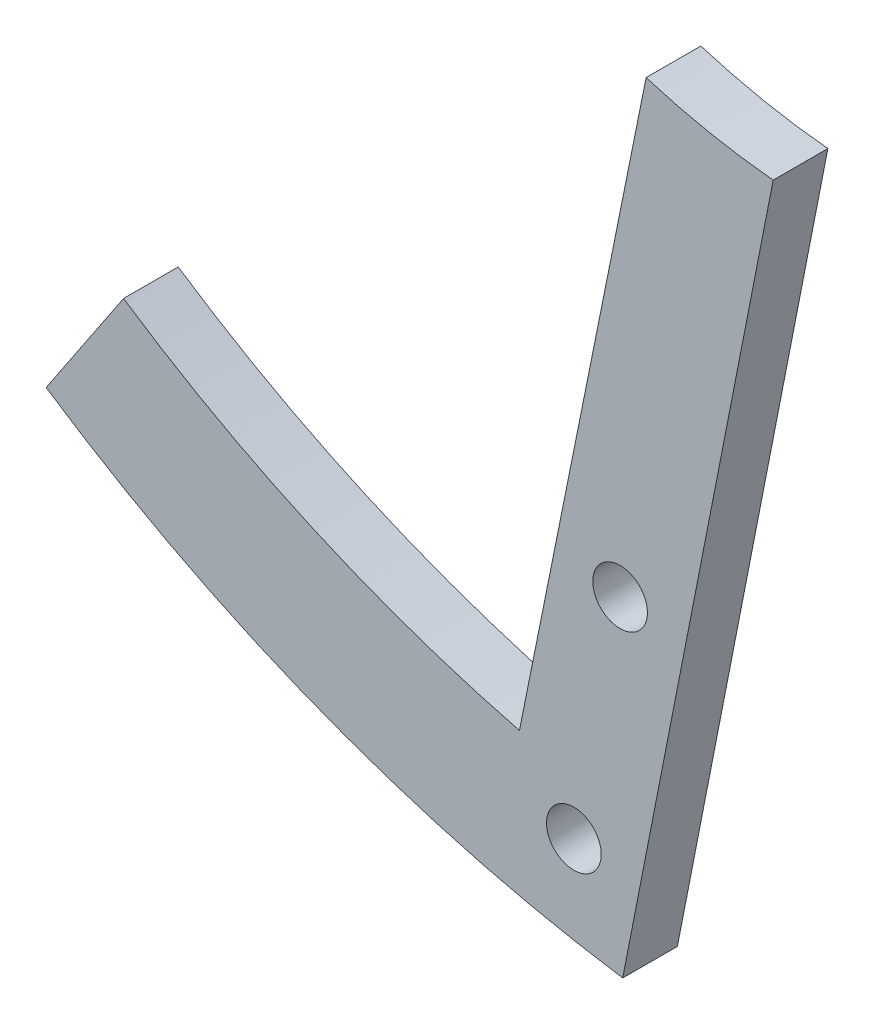
ISO-10303-21;
HEADER;
FILE_DESCRIPTION(('STEP AP214'),'2;1');
FILE_NAME('part.step','',(''),(''),'','','');
FILE_SCHEMA(('AUTOMOTIVE_DESIGN { 1 0 10303 214 1 1 1 1 }'));
ENDSEC;
DATA;
#1=APPLICATION_CONTEXT('core data for automotive mechanical design processes');
#2=APPLICATION_PROTOCOL_DEFINITION('international standard','automotive_design',2000,#1);
#3=PRODUCT_CONTEXT('',#1,'mechanical');
#4=PRODUCT('Part','Part','',(#3));
#5=PRODUCT_RELATED_PRODUCT_CATEGORY('part','',(#4));
#6=PRODUCT_DEFINITION_FORMATION('','',#4);
#7=PRODUCT_DEFINITION_CONTEXT('part definition',#1,'design');
#8=PRODUCT_DEFINITION('design','',#6,#7);
#9=PRODUCT_DEFINITION_SHAPE('','',#8);
#10=(LENGTH_UNIT() NAMED_UNIT(*) SI_UNIT(.MILLI.,.METRE.));
#11=(NAMED_UNIT(*) PLANE_ANGLE_UNIT() SI_UNIT($,.RADIAN.));
#12=(NAMED_UNIT(*) SI_UNIT($,.STERADIAN.) SOLID_ANGLE_UNIT());
#13=UNCERTAINTY_MEASURE_WITH_UNIT(LENGTH_MEASURE(1.E-05),#10,'distance_accuracy_value','');
#14=(GEOMETRIC_REPRESENTATION_CONTEXT(3) GLOBAL_UNCERTAINTY_ASSIGNED_CONTEXT((#13)) GLOBAL_UNIT_ASSIGNED_CONTEXT((#10,
#11,#12)) REPRESENTATION_CONTEXT('',''));
#15=CARTESIAN_POINT('',(0.,0.,0.));
#16=DIRECTION('',(0.,0.,1.));
#17=DIRECTION('',(1.,0.,0.));
#18=AXIS2_PLACEMENT_3D('',#15,#16,#17);
#19=CARTESIAN_POINT('',(0.,0.,3.));
#20=DIRECTION('',(0.,0.,1.));
#21=DIRECTION('',(1.,0.,0.));
#22=AXIS2_PLACEMENT_3D('',#19,#20,#21);
#23=PLANE('',#22);
#24=CARTESIAN_POINT('',(0.,0.,3.));
#25=DIRECTION('',(0.,0.,-1.));
#26=DIRECTION('',(-1.,0.,0.));
#27=AXIS2_PLACEMENT_3D('',#24,#25,#26);
#28=CIRCLE('',#27,35.);
#29=CARTESIAN_POINT('',(-3.30789993224488,-34.8433321890754,3.));
#30=VERTEX_POINT('',#29);
#31=CARTESIAN_POINT('',(-10.2778649141556,-33.4569199539702,3.));
#32=VERTEX_POINT('',#31);
#33=EDGE_CURVE('E104',#30,#32,#28,.T.);
#34=ORIENTED_EDGE('',*,*,#33,.T.);
#35=DIRECTION('',(-0.197468507584411,-0.980309231065578,0.));
#36=VECTOR('',#35,1.);
#37=CARTESIAN_POINT('',(-3.40049450336369,0.684978324541862,3.));
#38=LINE('',#37,#36);
#39=CARTESIAN_POINT('',(-17.2260845219051,-67.9505407559408,3.));
#40=VERTEX_POINT('',#39);
#41=EDGE_CURVE('E123',#32,#40,#38,.T.);
#42=ORIENTED_EDGE('',*,*,#41,.T.);
#43=CARTESIAN_POINT('',(0.,0.,3.));
#44=DIRECTION('',(0.,0.,1.));
#45=DIRECTION('',(1.,0.,0.));
#46=AXIS2_PLACEMENT_3D('',#43,#44,#45);
#47=CIRCLE('',#46,70.1000283664749);
#48=CARTESIAN_POINT('',(-38.9454890942429,-58.2860434082705,3.));
#49=VERTEX_POINT('',#48);
#50=EDGE_CURVE('E126',#49,#40,#47,.T.);
#51=ORIENTED_EDGE('',*,*,#50,.F.);
#52=DIRECTION('',(0.555570233019599,0.831469612302547,0.));
#53=VECTOR('',#52,1.);
#54=CARTESIAN_POINT('',(0.,0.,3.));
#55=LINE('',#54,#53);
#56=CARTESIAN_POINT('',(-43.1900456745127,-64.638471246262,3.));
#57=VERTEX_POINT('',#56);
#58=EDGE_CURVE('E131',#57,#49,#55,.T.);
#59=ORIENTED_EDGE('',*,*,#58,.F.);
#60=CARTESIAN_POINT('',(0.,0.,3.));
#61=DIRECTION('',(0.,0.,1.));
#62=DIRECTION('',(1.,0.,0.));
#63=AXIS2_PLACEMENT_3D('',#60,#61,#62);
#64=CIRCLE('',#63,77.7400283664749);
#65=CARTESIAN_POINT('',(-11.5626593310336,-76.8753336227869,3.));
#66=VERTEX_POINT('',#65);
#67=EDGE_CURVE('E134',#57,#66,#64,.T.);
#68=ORIENTED_EDGE('',*,*,#67,.T.);
#69=DIRECTION('',(-0.192710988850561,-0.981255560379782,0.));
#70=VECTOR('',#69,1.);
#71=CARTESIAN_POINT('',(3.40377712840618,-0.668475454027696,3.));
#72=LINE('',#71,#70);
#73=EDGE_CURVE('E85',#30,#66,#72,.T.);
#74=ORIENTED_EDGE('',*,*,#73,.F.);
#75=EDGE_LOOP('',(#34,#42,#51,#59,#68,#74));
#76=FACE_BOUND('',#75,.T.);
#77=CARTESIAN_POINT('',(-11.7054193209675,-58.8471168241939,3.));
#78=DIRECTION('',(0.,0.,-1.));
#79=DIRECTION('',(-1.,0.,0.));
#80=AXIS2_PLACEMENT_3D('',#77,#78,#79);
#81=CIRCLE('',#80,1.5);
#82=CARTESIAN_POINT('',(-13.2054193209675,-58.8471168241939,3.));
#83=VERTEX_POINT('',#82);
#84=EDGE_CURVE('E127',#83,#83,#81,.T.);
#85=ORIENTED_EDGE('',*,*,#84,.T.);
#86=EDGE_LOOP('',(#85));
#87=FACE_BOUND('',#86,.T.);
#88=CARTESIAN_POINT('',(-14.2415935071771,-71.5973254694359,3.));
#89=DIRECTION('',(0.,0.,-1.));
#90=DIRECTION('',(-1.,0.,0.));
#91=AXIS2_PLACEMENT_3D('',#88,#89,#90);
#92=CIRCLE('',#91,1.5);
#93=CARTESIAN_POINT('',(-15.7415935071771,-71.5973254694359,3.));
#94=VERTEX_POINT('',#93);
#95=EDGE_CURVE('E106',#94,#94,#92,.T.);
#96=ORIENTED_EDGE('',*,*,#95,.T.);
#97=EDGE_LOOP('',(#96));
#98=FACE_BOUND('',#97,.T.);
#99=ADVANCED_FACE('F40',(#76,#87,#98),#23,.T.);
#100=CARTESIAN_POINT('',(0.,0.,0.));
#101=DIRECTION('',(0.,0.,1.));
#102=DIRECTION('',(1.,0.,0.));
#103=AXIS2_PLACEMENT_3D('',#100,#101,#102);
#104=PLANE('',#103);
#105=CARTESIAN_POINT('',(-11.7054193209675,-58.8471168241939,0.));
#106=DIRECTION('',(0.,0.,-1.));
#107=DIRECTION('',(-1.,0.,0.));
#108=AXIS2_PLACEMENT_3D('',#105,#106,#107);
#109=CIRCLE('',#108,1.5);
#110=CARTESIAN_POINT('',(-13.2054193209675,-58.8471168241939,0.));
#111=VERTEX_POINT('',#110);
#112=EDGE_CURVE('E189',#111,#111,#109,.T.);
#113=ORIENTED_EDGE('',*,*,#112,.F.);
#114=EDGE_LOOP('',(#113));
#115=FACE_BOUND('',#114,.T.);
#116=CARTESIAN_POINT('',(-14.2415935071771,-71.5973254694359,0.));
#117=DIRECTION('',(0.,0.,-1.));
#118=DIRECTION('',(-1.,0.,0.));
#119=AXIS2_PLACEMENT_3D('',#116,#117,#118);
#120=CIRCLE('',#119,1.5);
#121=CARTESIAN_POINT('',(-15.7415935071771,-71.5973254694359,0.));
#122=VERTEX_POINT('',#121);
#123=EDGE_CURVE('E192',#122,#122,#120,.T.);
#124=ORIENTED_EDGE('',*,*,#123,.F.);
#125=EDGE_LOOP('',(#124));
#126=FACE_BOUND('',#125,.T.);
#127=DIRECTION('',(-0.197468507584411,-0.980309231065578,0.));
#128=VECTOR('',#127,1.);
#129=CARTESIAN_POINT('',(-3.40049450336369,0.684978324541862,0.));
#130=LINE('',#129,#128);
#131=CARTESIAN_POINT('',(-10.2778649141556,-33.4569199539702,0.));
#132=VERTEX_POINT('',#131);
#133=CARTESIAN_POINT('',(-17.2260845219051,-67.9505407559408,0.));
#134=VERTEX_POINT('',#133);
#135=EDGE_CURVE('E92',#132,#134,#130,.T.);
#136=ORIENTED_EDGE('',*,*,#135,.F.);
#137=CARTESIAN_POINT('',(0.,0.,0.));
#138=DIRECTION('',(0.,0.,-1.));
#139=DIRECTION('',(-1.,0.,0.));
#140=AXIS2_PLACEMENT_3D('',#137,#138,#139);
#141=CIRCLE('',#140,35.);
#142=CARTESIAN_POINT('',(-3.30789993224488,-34.8433321890754,0.));
#143=VERTEX_POINT('',#142);
#144=EDGE_CURVE('E55',#143,#132,#141,.T.);
#145=ORIENTED_EDGE('',*,*,#144,.F.);
#146=DIRECTION('',(-0.192710988850561,-0.981255560379782,0.));
#147=VECTOR('',#146,1.);
#148=CARTESIAN_POINT('',(3.40377712840618,-0.668475454027696,0.));
#149=LINE('',#148,#147);
#150=CARTESIAN_POINT('',(-11.5626593310336,-76.8753336227869,0.));
#151=VERTEX_POINT('',#150);
#152=EDGE_CURVE('E63',#143,#151,#149,.T.);
#153=ORIENTED_EDGE('',*,*,#152,.T.);
#154=CARTESIAN_POINT('',(0.,0.,0.));
#155=DIRECTION('',(0.,0.,1.));
#156=DIRECTION('',(1.,0.,0.));
#157=AXIS2_PLACEMENT_3D('',#154,#155,#156);
#158=CIRCLE('',#157,77.7400283664749);
#159=CARTESIAN_POINT('',(-43.1900456745127,-64.638471246262,0.));
#160=VERTEX_POINT('',#159);
#161=EDGE_CURVE('E114',#160,#151,#158,.T.);
#162=ORIENTED_EDGE('',*,*,#161,.F.);
#163=DIRECTION('',(0.555570233019599,0.831469612302547,0.));
#164=VECTOR('',#163,1.);
#165=CARTESIAN_POINT('',(0.,0.,0.));
#166=LINE('',#165,#164);
#167=CARTESIAN_POINT('',(-38.9454890942429,-58.2860434082705,0.));
#168=VERTEX_POINT('',#167);
#169=EDGE_CURVE('E119',#160,#168,#166,.T.);
#170=ORIENTED_EDGE('',*,*,#169,.T.);
#171=CARTESIAN_POINT('',(0.,0.,0.));
#172=DIRECTION('',(0.,0.,1.));
#173=DIRECTION('',(1.,0.,0.));
#174=AXIS2_PLACEMENT_3D('',#171,#172,#173);
#175=CIRCLE('',#174,70.1000283664749);
#176=EDGE_CURVE('E153',#168,#134,#175,.T.);
#177=ORIENTED_EDGE('',*,*,#176,.T.);
#178=EDGE_LOOP('',(#136,#145,#153,#162,#170,#177));
#179=FACE_BOUND('',#178,.T.);
#180=ADVANCED_FACE('F42',(#115,#126,#179),#104,.F.);
#181=CARTESIAN_POINT('',(3.40377712840618,-0.668475454027696,0.));
#182=DIRECTION('',(-0.981255560379782,0.192710988850561,0.));
#183=DIRECTION('',(-0.192710988850561,-0.981255560379782,0.));
#184=AXIS2_PLACEMENT_3D('',#181,#182,#183);
#185=PLANE('',#184);
#186=ORIENTED_EDGE('',*,*,#152,.F.);
#187=DIRECTION('',(0.,0.,-1.));
#188=VECTOR('',#187,1.);
#189=CARTESIAN_POINT('',(-3.30789993224488,-34.8433321890754,3.));
#190=LINE('',#189,#188);
#191=EDGE_CURVE('E101',#143,#30,#190,.F.);
#192=ORIENTED_EDGE('',*,*,#191,.T.);
#193=ORIENTED_EDGE('',*,*,#73,.T.);
#194=DIRECTION('',(0.,0.,1.));
#195=VECTOR('',#194,1.);
#196=CARTESIAN_POINT('',(-11.5626593310336,-76.8753336227869,0.));
#197=LINE('',#196,#195);
#198=EDGE_CURVE('E49',#151,#66,#197,.T.);
#199=ORIENTED_EDGE('',*,*,#198,.F.);
#200=EDGE_LOOP('',(#186,#192,#193,#199));
#201=FACE_BOUND('',#200,.T.);
#202=ADVANCED_FACE('F110',(#201),#185,.F.);
#203=CARTESIAN_POINT('',(0.,0.,0.));
#204=DIRECTION('',(0.,0.,1.));
#205=DIRECTION('',(1.,0.,0.));
#206=AXIS2_PLACEMENT_3D('',#203,#204,#205);
#207=CYLINDRICAL_SURFACE('',#206,77.7400283664749);
#208=ORIENTED_EDGE('',*,*,#67,.F.);
#209=DIRECTION('',(0.,0.,1.));
#210=VECTOR('',#209,1.);
#211=CARTESIAN_POINT('',(-43.1900456745127,-64.638471246262,0.));
#212=LINE('',#211,#210);
#213=EDGE_CURVE('E142',#160,#57,#212,.T.);
#214=ORIENTED_EDGE('',*,*,#213,.F.);
#215=ORIENTED_EDGE('',*,*,#161,.T.);
#216=ORIENTED_EDGE('',*,*,#198,.T.);
#217=EDGE_LOOP('',(#208,#214,#215,#216));
#218=FACE_BOUND('',#217,.T.);
#219=ADVANCED_FACE('F184',(#218),#207,.T.);
#220=CARTESIAN_POINT('',(0.,0.,0.));
#221=DIRECTION('',(0.831469612302547,-0.555570233019599,0.));
#222=DIRECTION('',(0.555570233019599,0.831469612302547,0.));
#223=AXIS2_PLACEMENT_3D('',#220,#221,#222);
#224=PLANE('',#223);
#225=ORIENTED_EDGE('',*,*,#58,.T.);
#226=DIRECTION('',(0.,0.,1.));
#227=VECTOR('',#226,1.);
#228=CARTESIAN_POINT('',(-38.9454890942429,-58.2860434082705,0.));
#229=LINE('',#228,#227);
#230=EDGE_CURVE('E118',#168,#49,#229,.T.);
#231=ORIENTED_EDGE('',*,*,#230,.F.);
#232=ORIENTED_EDGE('',*,*,#169,.F.);
#233=ORIENTED_EDGE('',*,*,#213,.T.);
#234=EDGE_LOOP('',(#225,#231,#232,#233));
#235=FACE_BOUND('',#234,.T.);
#236=ADVANCED_FACE('F174',(#235),#224,.F.);
#237=CARTESIAN_POINT('',(0.,0.,0.));
#238=DIRECTION('',(0.,0.,1.));
#239=DIRECTION('',(1.,0.,0.));
#240=AXIS2_PLACEMENT_3D('',#237,#238,#239);
#241=CYLINDRICAL_SURFACE('',#240,70.1000283664749);
#242=ORIENTED_EDGE('',*,*,#50,.T.);
#243=DIRECTION('',(0.,0.,1.));
#244=VECTOR('',#243,1.);
#245=CARTESIAN_POINT('',(-17.2260845219051,-67.9505407559408,0.));
#246=LINE('',#245,#244);
#247=EDGE_CURVE('E113',#134,#40,#246,.T.);
#248=ORIENTED_EDGE('',*,*,#247,.F.);
#249=ORIENTED_EDGE('',*,*,#176,.F.);
#250=ORIENTED_EDGE('',*,*,#230,.T.);
#251=EDGE_LOOP('',(#242,#248,#249,#250));
#252=FACE_BOUND('',#251,.T.);
#253=ADVANCED_FACE('F151',(#252),#241,.F.);
#254=CARTESIAN_POINT('',(-3.40049450336369,0.684978324541862,0.));
#255=DIRECTION('',(-0.980309231065578,0.197468507584411,0.));
#256=DIRECTION('',(-0.197468507584411,-0.980309231065578,0.));
#257=AXIS2_PLACEMENT_3D('',#254,#255,#256);
#258=PLANE('',#257);
#259=DIRECTION('',(0.,0.,-1.));
#260=VECTOR('',#259,1.);
#261=CARTESIAN_POINT('',(-10.2778649141556,-33.4569199539702,3.));
#262=LINE('',#261,#260);
#263=EDGE_CURVE('E11',#132,#32,#262,.F.);
#264=ORIENTED_EDGE('',*,*,#263,.F.);
#265=ORIENTED_EDGE('',*,*,#135,.T.);
#266=ORIENTED_EDGE('',*,*,#247,.T.);
#267=ORIENTED_EDGE('',*,*,#41,.F.);
#268=EDGE_LOOP('',(#264,#265,#266,#267));
#269=FACE_BOUND('',#268,.T.);
#270=ADVANCED_FACE('F161',(#269),#258,.T.);
#271=CARTESIAN_POINT('',(-14.2415935071771,-71.5973254694359,3.));
#272=DIRECTION('',(0.,0.,-1.));
#273=DIRECTION('',(-1.,0.,0.));
#274=AXIS2_PLACEMENT_3D('',#271,#272,#273);
#275=CYLINDRICAL_SURFACE('',#274,1.5);
#276=ORIENTED_EDGE('',*,*,#95,.F.);
#277=EDGE_LOOP('',(#276));
#278=FACE_BOUND('',#277,.T.);
#279=ORIENTED_EDGE('',*,*,#123,.T.);
#280=EDGE_LOOP('',(#279));
#281=FACE_BOUND('',#280,.T.);
#282=ADVANCED_FACE('F163',(#278,#281),#275,.F.);
#283=CARTESIAN_POINT('',(-11.7054193209675,-58.8471168241939,3.));
#284=DIRECTION('',(0.,0.,-1.));
#285=DIRECTION('',(-1.,0.,0.));
#286=AXIS2_PLACEMENT_3D('',#283,#284,#285);
#287=CYLINDRICAL_SURFACE('',#286,1.5);
#288=ORIENTED_EDGE('',*,*,#84,.F.);
#289=EDGE_LOOP('',(#288));
#290=FACE_BOUND('',#289,.T.);
#291=ORIENTED_EDGE('',*,*,#112,.T.);
#292=EDGE_LOOP('',(#291));
#293=FACE_BOUND('',#292,.T.);
#294=ADVANCED_FACE('F170',(#290,#293),#287,.F.);
#295=CARTESIAN_POINT('',(0.,0.,3.));
#296=DIRECTION('',(0.,0.,-1.));
#297=DIRECTION('',(-1.,0.,0.));
#298=AXIS2_PLACEMENT_3D('',#295,#296,#297);
#299=CYLINDRICAL_SURFACE('',#298,35.);
#300=ORIENTED_EDGE('',*,*,#144,.T.);
#301=ORIENTED_EDGE('',*,*,#263,.T.);
#302=ORIENTED_EDGE('',*,*,#33,.F.);
#303=ORIENTED_EDGE('',*,*,#191,.F.);
#304=EDGE_LOOP('',(#300,#301,#302,#303));
#305=FACE_BOUND('',#304,.T.);
#306=ADVANCED_FACE('F102',(#305),#299,.F.);
#307=CLOSED_SHELL('',(#99,#180,#202,#219,#236,#253,#270,#282,#294,#306));
#308=MANIFOLD_SOLID_BREP('B2',#307);
#309=ADVANCED_BREP_SHAPE_REPRESENTATION('',(#18,#308),#14);
#310=SHAPE_DEFINITION_REPRESENTATION(#9,#309);
ENDSEC;
END-ISO-10303-21;
